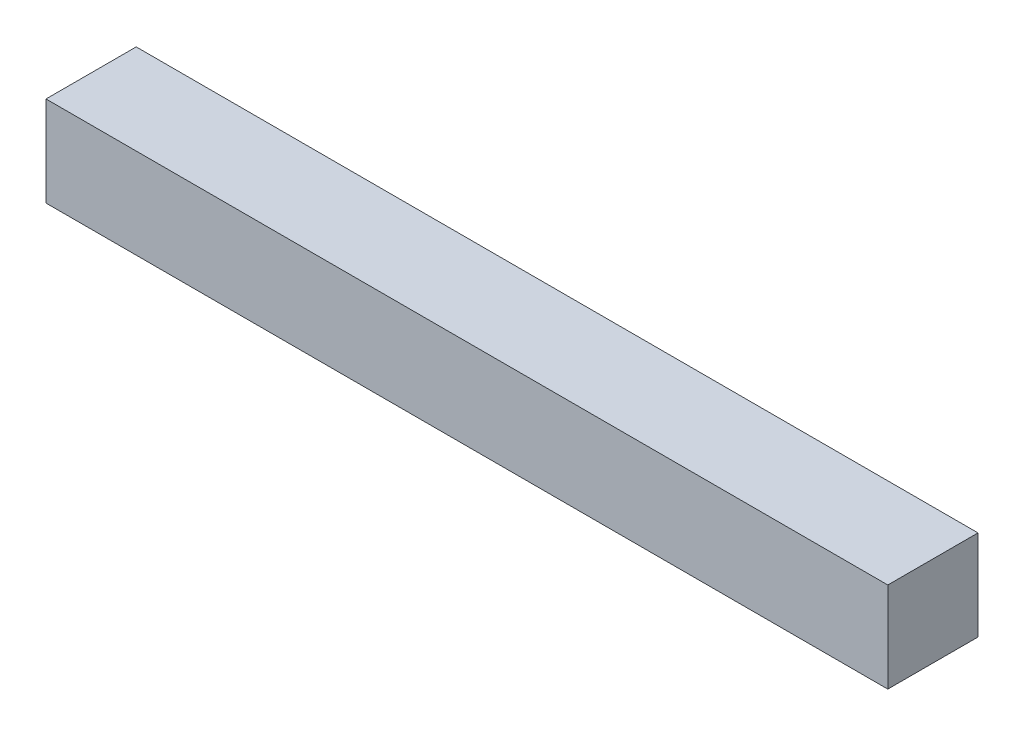
ISO-10303-21;
HEADER;
FILE_DESCRIPTION(('STEP AP214'),'2;1');
FILE_NAME('part.step','',(''),(''),'','','');
FILE_SCHEMA(('AUTOMOTIVE_DESIGN { 1 0 10303 214 1 1 1 1 }'));
ENDSEC;
DATA;
#1=APPLICATION_CONTEXT('core data for automotive mechanical design processes');
#2=APPLICATION_PROTOCOL_DEFINITION('international standard','automotive_design',2000,#1);
#3=PRODUCT_CONTEXT('',#1,'mechanical');
#4=PRODUCT('Part','Part','',(#3));
#5=PRODUCT_RELATED_PRODUCT_CATEGORY('part','',(#4));
#6=PRODUCT_DEFINITION_FORMATION('','',#4);
#7=PRODUCT_DEFINITION_CONTEXT('part definition',#1,'design');
#8=PRODUCT_DEFINITION('design','',#6,#7);
#9=PRODUCT_DEFINITION_SHAPE('','',#8);
#10=(LENGTH_UNIT() NAMED_UNIT(*) SI_UNIT(.MILLI.,.METRE.));
#11=(NAMED_UNIT(*) PLANE_ANGLE_UNIT() SI_UNIT($,.RADIAN.));
#12=(NAMED_UNIT(*) SI_UNIT($,.STERADIAN.) SOLID_ANGLE_UNIT());
#13=UNCERTAINTY_MEASURE_WITH_UNIT(LENGTH_MEASURE(1.E-05),#10,'distance_accuracy_value','');
#14=(GEOMETRIC_REPRESENTATION_CONTEXT(3) GLOBAL_UNCERTAINTY_ASSIGNED_CONTEXT((#13)) GLOBAL_UNIT_ASSIGNED_CONTEXT((#10,
#11,#12)) REPRESENTATION_CONTEXT('',''));
#15=CARTESIAN_POINT('',(0.,0.,0.));
#16=DIRECTION('',(0.,0.,1.));
#17=DIRECTION('',(1.,0.,0.));
#18=AXIS2_PLACEMENT_3D('',#15,#16,#17);
#19=CARTESIAN_POINT('',(-70.,245.,-20.));
#20=DIRECTION('',(-1.,0.,0.));
#21=DIRECTION('',(0.,0.,1.));
#22=AXIS2_PLACEMENT_3D('',#19,#20,#21);
#23=PLANE('',#22);
#24=DIRECTION('',(0.,-1.,0.));
#25=VECTOR('',#24,1.);
#26=CARTESIAN_POINT('',(-70.,245.,-5.));
#27=LINE('',#26,#25);
#28=CARTESIAN_POINT('',(-70.,260.,-5.));
#29=VERTEX_POINT('',#28);
#30=CARTESIAN_POINT('',(-70.,245.,-5.));
#31=VERTEX_POINT('',#30);
#32=EDGE_CURVE('E103',#29,#31,#27,.T.);
#33=ORIENTED_EDGE('',*,*,#32,.F.);
#34=DIRECTION('',(0.,0.,1.));
#35=VECTOR('',#34,1.);
#36=CARTESIAN_POINT('',(-70.,260.,-20.));
#37=LINE('',#36,#35);
#38=CARTESIAN_POINT('',(-70.,260.,-20.));
#39=VERTEX_POINT('',#38);
#40=EDGE_CURVE('E11',#39,#29,#37,.T.);
#41=ORIENTED_EDGE('',*,*,#40,.F.);
#42=DIRECTION('',(0.,-1.,0.));
#43=VECTOR('',#42,1.);
#44=CARTESIAN_POINT('',(-70.,245.,-20.));
#45=LINE('',#44,#43);
#46=CARTESIAN_POINT('',(-70.,245.,-20.));
#47=VERTEX_POINT('',#46);
#48=EDGE_CURVE('E97',#39,#47,#45,.T.);
#49=ORIENTED_EDGE('',*,*,#48,.T.);
#50=DIRECTION('',(0.,0.,1.));
#51=VECTOR('',#50,1.);
#52=CARTESIAN_POINT('',(-70.,245.,-20.));
#53=LINE('',#52,#51);
#54=EDGE_CURVE('E42',#47,#31,#53,.T.);
#55=ORIENTED_EDGE('',*,*,#54,.T.);
#56=EDGE_LOOP('',(#33,#41,#49,#55));
#57=FACE_BOUND('',#56,.T.);
#58=ADVANCED_FACE('F39',(#57),#23,.T.);
#59=CARTESIAN_POINT('',(-70.,260.,-20.));
#60=DIRECTION('',(0.,1.,0.));
#61=DIRECTION('',(0.,0.,1.));
#62=AXIS2_PLACEMENT_3D('',#59,#60,#61);
#63=PLANE('',#62);
#64=DIRECTION('',(-1.,0.,0.));
#65=VECTOR('',#64,1.);
#66=CARTESIAN_POINT('',(-70.,260.,-5.));
#67=LINE('',#66,#65);
#68=CARTESIAN_POINT('',(70.,260.,-5.));
#69=VERTEX_POINT('',#68);
#70=EDGE_CURVE('E99',#69,#29,#67,.T.);
#71=ORIENTED_EDGE('',*,*,#70,.F.);
#72=DIRECTION('',(0.,0.,1.));
#73=VECTOR('',#72,1.);
#74=CARTESIAN_POINT('',(70.,260.,-20.));
#75=LINE('',#74,#73);
#76=CARTESIAN_POINT('',(70.,260.,-20.));
#77=VERTEX_POINT('',#76);
#78=EDGE_CURVE('E48',#77,#69,#75,.T.);
#79=ORIENTED_EDGE('',*,*,#78,.F.);
#80=DIRECTION('',(-1.,0.,0.));
#81=VECTOR('',#80,1.);
#82=CARTESIAN_POINT('',(-70.,260.,-20.));
#83=LINE('',#82,#81);
#84=EDGE_CURVE('E94',#77,#39,#83,.T.);
#85=ORIENTED_EDGE('',*,*,#84,.T.);
#86=ORIENTED_EDGE('',*,*,#40,.T.);
#87=EDGE_LOOP('',(#71,#79,#85,#86));
#88=FACE_BOUND('',#87,.T.);
#89=ADVANCED_FACE('F113',(#88),#63,.T.);
#90=CARTESIAN_POINT('',(70.,245.,-20.));
#91=DIRECTION('',(1.,0.,0.));
#92=DIRECTION('',(0.,0.,-1.));
#93=AXIS2_PLACEMENT_3D('',#90,#91,#92);
#94=PLANE('',#93);
#95=DIRECTION('',(0.,1.,0.));
#96=VECTOR('',#95,1.);
#97=CARTESIAN_POINT('',(70.,245.,-5.));
#98=LINE('',#97,#96);
#99=CARTESIAN_POINT('',(70.,245.,-5.));
#100=VERTEX_POINT('',#99);
#101=EDGE_CURVE('E89',#100,#69,#98,.T.);
#102=ORIENTED_EDGE('',*,*,#101,.F.);
#103=DIRECTION('',(0.,0.,1.));
#104=VECTOR('',#103,1.);
#105=CARTESIAN_POINT('',(70.,245.,-20.));
#106=LINE('',#105,#104);
#107=CARTESIAN_POINT('',(70.,245.,-20.));
#108=VERTEX_POINT('',#107);
#109=EDGE_CURVE('E84',#108,#100,#106,.T.);
#110=ORIENTED_EDGE('',*,*,#109,.F.);
#111=DIRECTION('',(0.,1.,0.));
#112=VECTOR('',#111,1.);
#113=CARTESIAN_POINT('',(70.,245.,-20.));
#114=LINE('',#113,#112);
#115=EDGE_CURVE('E87',#108,#77,#114,.T.);
#116=ORIENTED_EDGE('',*,*,#115,.T.);
#117=ORIENTED_EDGE('',*,*,#78,.T.);
#118=EDGE_LOOP('',(#102,#110,#116,#117));
#119=FACE_BOUND('',#118,.T.);
#120=ADVANCED_FACE('F86',(#119),#94,.T.);
#121=CARTESIAN_POINT('',(-70.,245.,-20.));
#122=DIRECTION('',(0.,-1.,0.));
#123=DIRECTION('',(0.,0.,-1.));
#124=AXIS2_PLACEMENT_3D('',#121,#122,#123);
#125=PLANE('',#124);
#126=DIRECTION('',(1.,0.,0.));
#127=VECTOR('',#126,1.);
#128=CARTESIAN_POINT('',(-70.,245.,-5.));
#129=LINE('',#128,#127);
#130=EDGE_CURVE('E106',#31,#100,#129,.T.);
#131=ORIENTED_EDGE('',*,*,#130,.F.);
#132=ORIENTED_EDGE('',*,*,#54,.F.);
#133=DIRECTION('',(1.,0.,0.));
#134=VECTOR('',#133,1.);
#135=CARTESIAN_POINT('',(-70.,245.,-20.));
#136=LINE('',#135,#134);
#137=EDGE_CURVE('E93',#47,#108,#136,.T.);
#138=ORIENTED_EDGE('',*,*,#137,.T.);
#139=ORIENTED_EDGE('',*,*,#109,.T.);
#140=EDGE_LOOP('',(#131,#132,#138,#139));
#141=FACE_BOUND('',#140,.T.);
#142=ADVANCED_FACE('F96',(#141),#125,.T.);
#143=CARTESIAN_POINT('',(0.,0.,-20.));
#144=DIRECTION('',(0.,0.,-1.));
#145=DIRECTION('',(-1.,0.,0.));
#146=AXIS2_PLACEMENT_3D('',#143,#144,#145);
#147=PLANE('',#146);
#148=ORIENTED_EDGE('',*,*,#48,.F.);
#149=ORIENTED_EDGE('',*,*,#84,.F.);
#150=ORIENTED_EDGE('',*,*,#115,.F.);
#151=ORIENTED_EDGE('',*,*,#137,.F.);
#152=EDGE_LOOP('',(#148,#149,#150,#151));
#153=FACE_BOUND('',#152,.T.);
#154=ADVANCED_FACE('F92',(#153),#147,.T.);
#155=CARTESIAN_POINT('',(0.,0.,-5.));
#156=DIRECTION('',(0.,0.,-1.));
#157=DIRECTION('',(-1.,0.,0.));
#158=AXIS2_PLACEMENT_3D('',#155,#156,#157);
#159=PLANE('',#158);
#160=ORIENTED_EDGE('',*,*,#32,.T.);
#161=ORIENTED_EDGE('',*,*,#130,.T.);
#162=ORIENTED_EDGE('',*,*,#101,.T.);
#163=ORIENTED_EDGE('',*,*,#70,.T.);
#164=EDGE_LOOP('',(#160,#161,#162,#163));
#165=FACE_BOUND('',#164,.T.);
#166=ADVANCED_FACE('F112',(#165),#159,.F.);
#167=CLOSED_SHELL('',(#58,#89,#120,#142,#154,#166));
#168=MANIFOLD_SOLID_BREP('B2',#167);
#169=ADVANCED_BREP_SHAPE_REPRESENTATION('',(#18,#168),#14);
#170=SHAPE_DEFINITION_REPRESENTATION(#9,#169);
ENDSEC;
END-ISO-10303-21;
